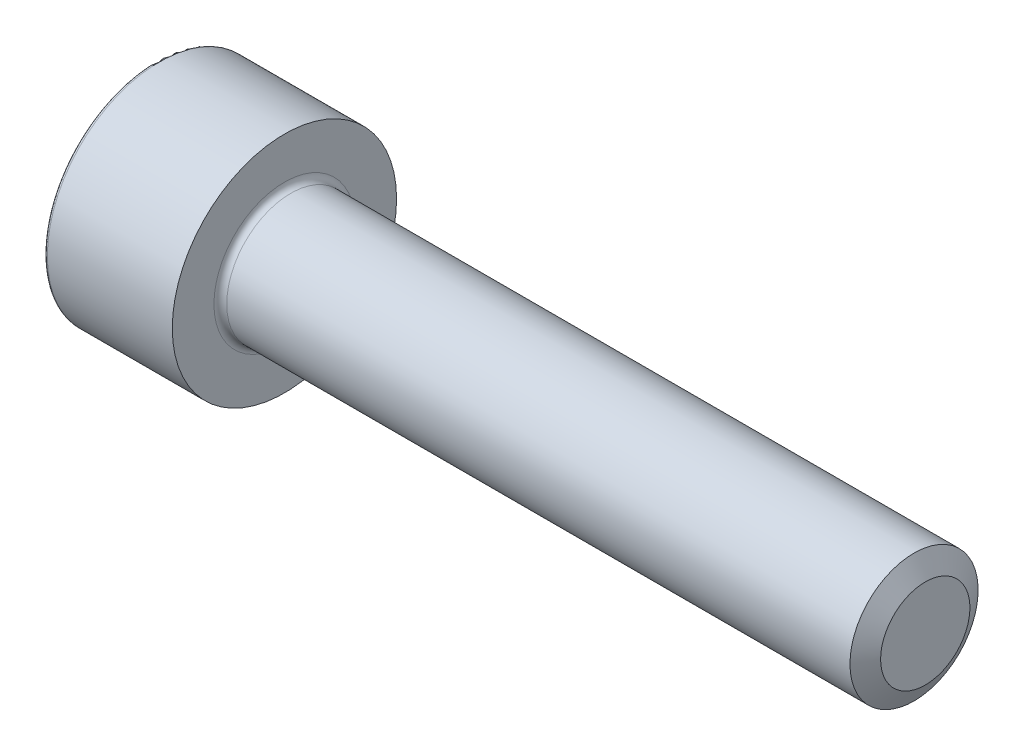
ISO-10303-21;
HEADER;
FILE_DESCRIPTION(('STEP AP214'),'2;1');
FILE_NAME('part.step','',(''),(''),'','','');
FILE_SCHEMA(('AUTOMOTIVE_DESIGN { 1 0 10303 214 1 1 1 1 }'));
ENDSEC;
DATA;
#1=APPLICATION_CONTEXT('core data for automotive mechanical design processes');
#2=APPLICATION_PROTOCOL_DEFINITION('international standard','automotive_design',2000,#1);
#3=PRODUCT_CONTEXT('',#1,'mechanical');
#4=PRODUCT('Part','Part','',(#3));
#5=PRODUCT_RELATED_PRODUCT_CATEGORY('part','',(#4));
#6=PRODUCT_DEFINITION_FORMATION('','',#4);
#7=PRODUCT_DEFINITION_CONTEXT('part definition',#1,'design');
#8=PRODUCT_DEFINITION('design','',#6,#7);
#9=PRODUCT_DEFINITION_SHAPE('','',#8);
#10=(LENGTH_UNIT() NAMED_UNIT(*) SI_UNIT(.MILLI.,.METRE.));
#11=(NAMED_UNIT(*) PLANE_ANGLE_UNIT() SI_UNIT($,.RADIAN.));
#12=(NAMED_UNIT(*) SI_UNIT($,.STERADIAN.) SOLID_ANGLE_UNIT());
#13=UNCERTAINTY_MEASURE_WITH_UNIT(LENGTH_MEASURE(1.E-05),#10,'distance_accuracy_value','');
#14=(GEOMETRIC_REPRESENTATION_CONTEXT(3) GLOBAL_UNCERTAINTY_ASSIGNED_CONTEXT((#13)) GLOBAL_UNIT_ASSIGNED_CONTEXT((#10,
#11,#12)) REPRESENTATION_CONTEXT('',''));
#15=CARTESIAN_POINT('',(0.,0.,0.));
#16=DIRECTION('',(0.,0.,1.));
#17=DIRECTION('',(1.,0.,0.));
#18=AXIS2_PLACEMENT_3D('',#15,#16,#17);
#19=CARTESIAN_POINT('',(0.,0.,0.));
#20=DIRECTION('',(-1.,0.,0.));
#21=DIRECTION('',(0.,0.,1.));
#22=AXIS2_PLACEMENT_3D('',#19,#20,#21);
#23=CYLINDRICAL_SURFACE('',#22,2.);
#24=CARTESIAN_POINT('',(4.2,0.,0.));
#25=DIRECTION('',(-1.,0.,0.));
#26=DIRECTION('',(0.,0.,1.));
#27=AXIS2_PLACEMENT_3D('',#24,#25,#26);
#28=CIRCLE('',#27,2.);
#29=CARTESIAN_POINT('',(4.2,0.,2.));
#30=VERTEX_POINT('',#29);
#31=EDGE_CURVE('E141',#30,#30,#28,.T.);
#32=ORIENTED_EDGE('',*,*,#31,.F.);
#33=EDGE_LOOP('',(#32));
#34=FACE_BOUND('',#33,.T.);
#35=CARTESIAN_POINT('',(23.6500102668172,0.,0.));
#36=DIRECTION('',(-1.,0.,0.));
#37=DIRECTION('',(0.,0.,1.));
#38=AXIS2_PLACEMENT_3D('',#35,#36,#37);
#39=CIRCLE('',#38,2.);
#40=CARTESIAN_POINT('',(23.6500102668172,0.,2.));
#41=VERTEX_POINT('',#40);
#42=EDGE_CURVE('E278',#41,#41,#39,.T.);
#43=ORIENTED_EDGE('',*,*,#42,.T.);
#44=EDGE_LOOP('',(#43));
#45=FACE_BOUND('',#44,.T.);
#46=ADVANCED_FACE('F38',(#34,#45),#23,.T.);
#47=CARTESIAN_POINT('',(0.,0.,0.));
#48=DIRECTION('',(1.,0.,0.));
#49=DIRECTION('',(0.,0.,-1.));
#50=AXIS2_PLACEMENT_3D('',#47,#48,#49);
#51=PLANE('',#50);
#52=CARTESIAN_POINT('',(0.,0.,0.));
#53=DIRECTION('',(1.,0.,0.));
#54=DIRECTION('',(0.,0.,-1.));
#55=AXIS2_PLACEMENT_3D('',#52,#53,#54);
#56=CIRCLE('',#55,3.4);
#57=CARTESIAN_POINT('',(0.,0.,-3.4));
#58=VERTEX_POINT('',#57);
#59=EDGE_CURVE('E46',#58,#58,#56,.F.);
#60=ORIENTED_EDGE('',*,*,#59,.T.);
#61=EDGE_LOOP('',(#60));
#62=FACE_BOUND('',#61,.T.);
#63=DIRECTION('',(0.,0.866025403784438,-0.5));
#64=VECTOR('',#63,1.);
#65=CARTESIAN_POINT('',(0.,0.,1.72));
#66=LINE('',#65,#64);
#67=CARTESIAN_POINT('',(0.,0.,1.72));
#68=VERTEX_POINT('',#67);
#69=CARTESIAN_POINT('',(0.,1.48956369450923,0.859999999999999));
#70=VERTEX_POINT('',#69);
#71=EDGE_CURVE('E127',#68,#70,#66,.T.);
#72=ORIENTED_EDGE('',*,*,#71,.F.);
#73=DIRECTION('',(0.,0.866025403784439,0.5));
#74=VECTOR('',#73,1.);
#75=CARTESIAN_POINT('',(0.,-1.48956369450923,0.86));
#76=LINE('',#75,#74);
#77=CARTESIAN_POINT('',(0.,-1.48956369450923,0.86));
#78=VERTEX_POINT('',#77);
#79=EDGE_CURVE('E53',#78,#68,#76,.T.);
#80=ORIENTED_EDGE('',*,*,#79,.F.);
#81=DIRECTION('',(0.,0.,1.));
#82=VECTOR('',#81,1.);
#83=CARTESIAN_POINT('',(0.,-1.48956369450923,-0.86));
#84=LINE('',#83,#82);
#85=CARTESIAN_POINT('',(0.,-1.48956369450923,-0.86));
#86=VERTEX_POINT('',#85);
#87=EDGE_CURVE('E137',#86,#78,#84,.T.);
#88=ORIENTED_EDGE('',*,*,#87,.F.);
#89=DIRECTION('',(0.,-0.866025403784438,0.5));
#90=VECTOR('',#89,1.);
#91=CARTESIAN_POINT('',(0.,0.,-1.72));
#92=LINE('',#91,#90);
#93=CARTESIAN_POINT('',(0.,0.,-1.72));
#94=VERTEX_POINT('',#93);
#95=EDGE_CURVE('E135',#94,#86,#92,.T.);
#96=ORIENTED_EDGE('',*,*,#95,.F.);
#97=DIRECTION('',(0.,-0.866025403784439,-0.5));
#98=VECTOR('',#97,1.);
#99=CARTESIAN_POINT('',(0.,1.48956369450923,-0.86));
#100=LINE('',#99,#98);
#101=CARTESIAN_POINT('',(0.,1.48956369450923,-0.86));
#102=VERTEX_POINT('',#101);
#103=EDGE_CURVE('E101',#102,#94,#100,.T.);
#104=ORIENTED_EDGE('',*,*,#103,.F.);
#105=DIRECTION('',(0.,0.,-1.));
#106=VECTOR('',#105,1.);
#107=CARTESIAN_POINT('',(0.,1.48956369450923,0.859999999999999));
#108=LINE('',#107,#106);
#109=EDGE_CURVE('E131',#70,#102,#108,.T.);
#110=ORIENTED_EDGE('',*,*,#109,.F.);
#111=EDGE_LOOP('',(#72,#80,#88,#96,#104,#110));
#112=FACE_BOUND('',#111,.T.);
#113=ADVANCED_FACE('F158',(#62,#112),#51,.F.);
#114=CARTESIAN_POINT('',(0.,0.,0.));
#115=DIRECTION('',(-1.,0.,0.));
#116=DIRECTION('',(0.,0.,1.));
#117=AXIS2_PLACEMENT_3D('',#114,#115,#116);
#118=CYLINDRICAL_SURFACE('',#117,3.5);
#119=CARTESIAN_POINT('',(0.1,0.,0.));
#120=DIRECTION('',(1.,0.,0.));
#121=DIRECTION('',(0.,0.,-1.));
#122=AXIS2_PLACEMENT_3D('',#119,#120,#121);
#123=CIRCLE('',#122,3.5);
#124=CARTESIAN_POINT('',(0.1,0.,-3.5));
#125=VERTEX_POINT('',#124);
#126=EDGE_CURVE('E11',#125,#125,#123,.T.);
#127=ORIENTED_EDGE('',*,*,#126,.T.);
#128=EDGE_LOOP('',(#127));
#129=FACE_BOUND('',#128,.T.);
#130=CARTESIAN_POINT('',(4.,0.,0.));
#131=DIRECTION('',(-1.,0.,0.));
#132=DIRECTION('',(0.,0.,1.));
#133=AXIS2_PLACEMENT_3D('',#130,#131,#132);
#134=CIRCLE('',#133,3.5);
#135=CARTESIAN_POINT('',(4.,0.,3.5));
#136=VERTEX_POINT('',#135);
#137=EDGE_CURVE('E152',#136,#136,#134,.T.);
#138=ORIENTED_EDGE('',*,*,#137,.T.);
#139=EDGE_LOOP('',(#138));
#140=FACE_BOUND('',#139,.T.);
#141=ADVANCED_FACE('F177',(#129,#140),#118,.T.);
#142=CARTESIAN_POINT('',(4.,3.5,0.));
#143=DIRECTION('',(-1.,0.,0.));
#144=DIRECTION('',(0.,0.,1.));
#145=AXIS2_PLACEMENT_3D('',#142,#143,#144);
#146=PLANE('',#145);
#147=ORIENTED_EDGE('',*,*,#137,.F.);
#148=EDGE_LOOP('',(#147));
#149=FACE_BOUND('',#148,.T.);
#150=CARTESIAN_POINT('',(4.,0.,0.));
#151=DIRECTION('',(-1.,0.,0.));
#152=DIRECTION('',(0.,0.,1.));
#153=AXIS2_PLACEMENT_3D('',#150,#151,#152);
#154=CIRCLE('',#153,2.2);
#155=CARTESIAN_POINT('',(4.,0.,2.2));
#156=VERTEX_POINT('',#155);
#157=EDGE_CURVE('E149',#156,#156,#154,.T.);
#158=ORIENTED_EDGE('',*,*,#157,.T.);
#159=EDGE_LOOP('',(#158));
#160=FACE_BOUND('',#159,.T.);
#161=ADVANCED_FACE('F186',(#149,#160),#146,.F.);
#162=CARTESIAN_POINT('',(4.2,0.,0.));
#163=DIRECTION('',(-1.,0.,0.));
#164=DIRECTION('',(0.,0.,1.));
#165=AXIS2_PLACEMENT_3D('',#162,#163,#164);
#166=TOROIDAL_SURFACE('',#165,2.2,0.2);
#167=ORIENTED_EDGE('',*,*,#157,.F.);
#168=EDGE_LOOP('',(#167));
#169=FACE_BOUND('',#168,.T.);
#170=ORIENTED_EDGE('',*,*,#31,.T.);
#171=EDGE_LOOP('',(#170));
#172=FACE_BOUND('',#171,.T.);
#173=ADVANCED_FACE('F182',(#169,#172),#166,.F.);
#174=CARTESIAN_POINT('',(2.,-1.48956369450923,0.86));
#175=DIRECTION('',(0.,-0.5,0.866025403784439));
#176=DIRECTION('',(0.,-0.866025403784439,-0.5));
#177=AXIS2_PLACEMENT_3D('',#174,#175,#176);
#178=PLANE('',#177);
#179=ORIENTED_EDGE('',*,*,#79,.T.);
#180=DIRECTION('',(-1.,0.,0.));
#181=VECTOR('',#180,1.);
#182=CARTESIAN_POINT('',(2.,0.,1.72));
#183=LINE('',#182,#181);
#184=CARTESIAN_POINT('',(2.,0.,1.72));
#185=VERTEX_POINT('',#184);
#186=EDGE_CURVE('E83',#185,#68,#183,.T.);
#187=ORIENTED_EDGE('',*,*,#186,.F.);
#188=DIRECTION('',(0.,0.866025403784439,0.5));
#189=VECTOR('',#188,1.);
#190=CARTESIAN_POINT('',(2.,-1.48956369450923,0.86));
#191=LINE('',#190,#189);
#192=CARTESIAN_POINT('',(2.,-1.48956369450923,0.86));
#193=VERTEX_POINT('',#192);
#194=EDGE_CURVE('E139',#193,#185,#191,.T.);
#195=ORIENTED_EDGE('',*,*,#194,.F.);
#196=DIRECTION('',(-1.,0.,0.));
#197=VECTOR('',#196,1.);
#198=CARTESIAN_POINT('',(2.,-1.48956369450923,0.86));
#199=LINE('',#198,#197);
#200=EDGE_CURVE('E61',#193,#78,#199,.T.);
#201=ORIENTED_EDGE('',*,*,#200,.T.);
#202=EDGE_LOOP('',(#179,#187,#195,#201));
#203=FACE_BOUND('',#202,.T.);
#204=ADVANCED_FACE('F185',(#203),#178,.F.);
#205=CARTESIAN_POINT('',(2.,-1.48956369450923,-0.86));
#206=DIRECTION('',(0.,-1.,0.));
#207=DIRECTION('',(0.,0.,-1.));
#208=AXIS2_PLACEMENT_3D('',#205,#206,#207);
#209=PLANE('',#208);
#210=ORIENTED_EDGE('',*,*,#87,.T.);
#211=ORIENTED_EDGE('',*,*,#200,.F.);
#212=DIRECTION('',(0.,0.,1.));
#213=VECTOR('',#212,1.);
#214=CARTESIAN_POINT('',(2.,-1.48956369450923,-0.86));
#215=LINE('',#214,#213);
#216=CARTESIAN_POINT('',(2.,-1.48956369450923,-0.86));
#217=VERTEX_POINT('',#216);
#218=EDGE_CURVE('E113',#217,#193,#215,.T.);
#219=ORIENTED_EDGE('',*,*,#218,.F.);
#220=DIRECTION('',(-1.,0.,0.));
#221=VECTOR('',#220,1.);
#222=CARTESIAN_POINT('',(2.,-1.48956369450923,-0.86));
#223=LINE('',#222,#221);
#224=EDGE_CURVE('E105',#217,#86,#223,.T.);
#225=ORIENTED_EDGE('',*,*,#224,.T.);
#226=EDGE_LOOP('',(#210,#211,#219,#225));
#227=FACE_BOUND('',#226,.T.);
#228=ADVANCED_FACE('F216',(#227),#209,.F.);
#229=CARTESIAN_POINT('',(2.,0.,-1.72));
#230=DIRECTION('',(0.,-0.5,-0.866025403784439));
#231=DIRECTION('',(0.,0.866025403784438,-0.5));
#232=AXIS2_PLACEMENT_3D('',#229,#230,#231);
#233=PLANE('',#232);
#234=ORIENTED_EDGE('',*,*,#95,.T.);
#235=ORIENTED_EDGE('',*,*,#224,.F.);
#236=DIRECTION('',(0.,-0.866025403784438,0.5));
#237=VECTOR('',#236,1.);
#238=CARTESIAN_POINT('',(2.,0.,-1.72));
#239=LINE('',#238,#237);
#240=CARTESIAN_POINT('',(2.,0.,-1.72));
#241=VERTEX_POINT('',#240);
#242=EDGE_CURVE('E109',#241,#217,#239,.T.);
#243=ORIENTED_EDGE('',*,*,#242,.F.);
#244=DIRECTION('',(-1.,0.,0.));
#245=VECTOR('',#244,1.);
#246=CARTESIAN_POINT('',(2.,0.,-1.72));
#247=LINE('',#246,#245);
#248=EDGE_CURVE('E94',#241,#94,#247,.T.);
#249=ORIENTED_EDGE('',*,*,#248,.T.);
#250=EDGE_LOOP('',(#234,#235,#243,#249));
#251=FACE_BOUND('',#250,.T.);
#252=ADVANCED_FACE('F110',(#251),#233,.F.);
#253=CARTESIAN_POINT('',(2.,1.48956369450923,-0.86));
#254=DIRECTION('',(0.,0.5,-0.866025403784439));
#255=DIRECTION('',(0.,0.866025403784439,0.5));
#256=AXIS2_PLACEMENT_3D('',#253,#254,#255);
#257=PLANE('',#256);
#258=ORIENTED_EDGE('',*,*,#103,.T.);
#259=ORIENTED_EDGE('',*,*,#248,.F.);
#260=DIRECTION('',(0.,-0.866025403784439,-0.5));
#261=VECTOR('',#260,1.);
#262=CARTESIAN_POINT('',(2.,1.48956369450923,-0.86));
#263=LINE('',#262,#261);
#264=CARTESIAN_POINT('',(2.,1.48956369450923,-0.86));
#265=VERTEX_POINT('',#264);
#266=EDGE_CURVE('E98',#265,#241,#263,.T.);
#267=ORIENTED_EDGE('',*,*,#266,.F.);
#268=DIRECTION('',(-1.,0.,0.));
#269=VECTOR('',#268,1.);
#270=CARTESIAN_POINT('',(2.,1.48956369450923,-0.86));
#271=LINE('',#270,#269);
#272=EDGE_CURVE('E106',#265,#102,#271,.T.);
#273=ORIENTED_EDGE('',*,*,#272,.T.);
#274=EDGE_LOOP('',(#258,#259,#267,#273));
#275=FACE_BOUND('',#274,.T.);
#276=ADVANCED_FACE('F96',(#275),#257,.F.);
#277=CARTESIAN_POINT('',(2.,1.48956369450923,0.859999999999999));
#278=DIRECTION('',(0.,1.,0.));
#279=DIRECTION('',(0.,0.,1.));
#280=AXIS2_PLACEMENT_3D('',#277,#278,#279);
#281=PLANE('',#280);
#282=ORIENTED_EDGE('',*,*,#109,.T.);
#283=ORIENTED_EDGE('',*,*,#272,.F.);
#284=DIRECTION('',(0.,0.,-1.));
#285=VECTOR('',#284,1.);
#286=CARTESIAN_POINT('',(2.,1.48956369450923,0.859999999999999));
#287=LINE('',#286,#285);
#288=CARTESIAN_POINT('',(2.,1.48956369450923,0.859999999999999));
#289=VERTEX_POINT('',#288);
#290=EDGE_CURVE('E119',#289,#265,#287,.T.);
#291=ORIENTED_EDGE('',*,*,#290,.F.);
#292=DIRECTION('',(-1.,0.,0.));
#293=VECTOR('',#292,1.);
#294=CARTESIAN_POINT('',(2.,1.48956369450923,0.859999999999999));
#295=LINE('',#294,#293);
#296=EDGE_CURVE('E144',#289,#70,#295,.T.);
#297=ORIENTED_EDGE('',*,*,#296,.T.);
#298=EDGE_LOOP('',(#282,#283,#291,#297));
#299=FACE_BOUND('',#298,.T.);
#300=ADVANCED_FACE('F234',(#299),#281,.F.);
#301=CARTESIAN_POINT('',(2.,0.,1.72));
#302=DIRECTION('',(0.,0.5,0.866025403784439));
#303=DIRECTION('',(0.,-0.866025403784438,0.5));
#304=AXIS2_PLACEMENT_3D('',#301,#302,#303);
#305=PLANE('',#304);
#306=ORIENTED_EDGE('',*,*,#71,.T.);
#307=ORIENTED_EDGE('',*,*,#296,.F.);
#308=DIRECTION('',(0.,0.866025403784438,-0.5));
#309=VECTOR('',#308,1.);
#310=CARTESIAN_POINT('',(2.,0.,1.72));
#311=LINE('',#310,#309);
#312=EDGE_CURVE('E121',#185,#289,#311,.T.);
#313=ORIENTED_EDGE('',*,*,#312,.F.);
#314=ORIENTED_EDGE('',*,*,#186,.T.);
#315=EDGE_LOOP('',(#306,#307,#313,#314));
#316=FACE_BOUND('',#315,.T.);
#317=ADVANCED_FACE('F241',(#316),#305,.F.);
#318=CARTESIAN_POINT('',(2.,1.48956369450923,2.58));
#319=DIRECTION('',(-1.,0.,0.));
#320=DIRECTION('',(0.,0.,1.));
#321=AXIS2_PLACEMENT_3D('',#318,#319,#320);
#322=PLANE('',#321);
#323=ORIENTED_EDGE('',*,*,#194,.T.);
#324=ORIENTED_EDGE('',*,*,#312,.T.);
#325=ORIENTED_EDGE('',*,*,#290,.T.);
#326=ORIENTED_EDGE('',*,*,#266,.T.);
#327=ORIENTED_EDGE('',*,*,#242,.T.);
#328=ORIENTED_EDGE('',*,*,#218,.T.);
#329=EDGE_LOOP('',(#323,#324,#325,#326,#327,#328));
#330=FACE_BOUND('',#329,.T.);
#331=ADVANCED_FACE('F116',(#330),#322,.T.);
#332=CARTESIAN_POINT('',(23.6500102668172,0.,0.));
#333=DIRECTION('',(-1.,0.,0.));
#334=DIRECTION('',(0.,0.,1.));
#335=AXIS2_PLACEMENT_3D('',#332,#333,#334);
#336=CONICAL_SURFACE('',#335,2.,1.04719755119659);
#337=CARTESIAN_POINT('',(24.,0.,0.));
#338=DIRECTION('',(-1.,0.,0.));
#339=DIRECTION('',(0.,0.,1.));
#340=AXIS2_PLACEMENT_3D('',#337,#338,#339);
#341=CIRCLE('',#340,1.3938);
#342=CARTESIAN_POINT('',(24.,0.,1.3938));
#343=VERTEX_POINT('',#342);
#344=EDGE_CURVE('E128',#343,#343,#341,.T.);
#345=ORIENTED_EDGE('',*,*,#344,.T.);
#346=EDGE_LOOP('',(#345));
#347=FACE_BOUND('',#346,.T.);
#348=ORIENTED_EDGE('',*,*,#42,.F.);
#349=EDGE_LOOP('',(#348));
#350=FACE_BOUND('',#349,.T.);
#351=ADVANCED_FACE('F167',(#347,#350),#336,.T.);
#352=CARTESIAN_POINT('',(24.,2.,0.));
#353=DIRECTION('',(-1.,0.,0.));
#354=DIRECTION('',(0.,0.,1.));
#355=AXIS2_PLACEMENT_3D('',#352,#353,#354);
#356=PLANE('',#355);
#357=ORIENTED_EDGE('',*,*,#344,.F.);
#358=EDGE_LOOP('',(#357));
#359=FACE_BOUND('',#358,.T.);
#360=ADVANCED_FACE('F162',(#359),#356,.F.);
#361=CARTESIAN_POINT('',(0.1,0.,0.));
#362=DIRECTION('',(1.,0.,0.));
#363=DIRECTION('',(0.,0.,-1.));
#364=AXIS2_PLACEMENT_3D('',#361,#362,#363);
#365=TOROIDAL_SURFACE('',#364,3.4,0.1);
#366=ORIENTED_EDGE('',*,*,#126,.F.);
#367=EDGE_LOOP('',(#366));
#368=FACE_BOUND('',#367,.T.);
#369=ORIENTED_EDGE('',*,*,#59,.F.);
#370=EDGE_LOOP('',(#369));
#371=FACE_BOUND('',#370,.T.);
#372=ADVANCED_FACE('F40',(#368,#371),#365,.T.);
#373=CLOSED_SHELL('',(#46,#113,#141,#161,#173,#204,#228,#252,#276,#300,#317,#331,#351,#360,#372));
#374=MANIFOLD_SOLID_BREP('B2',#373);
#375=ADVANCED_BREP_SHAPE_REPRESENTATION('',(#18,#374),#14);
#376=SHAPE_DEFINITION_REPRESENTATION(#9,#375);
ENDSEC;
END-ISO-10303-21;
